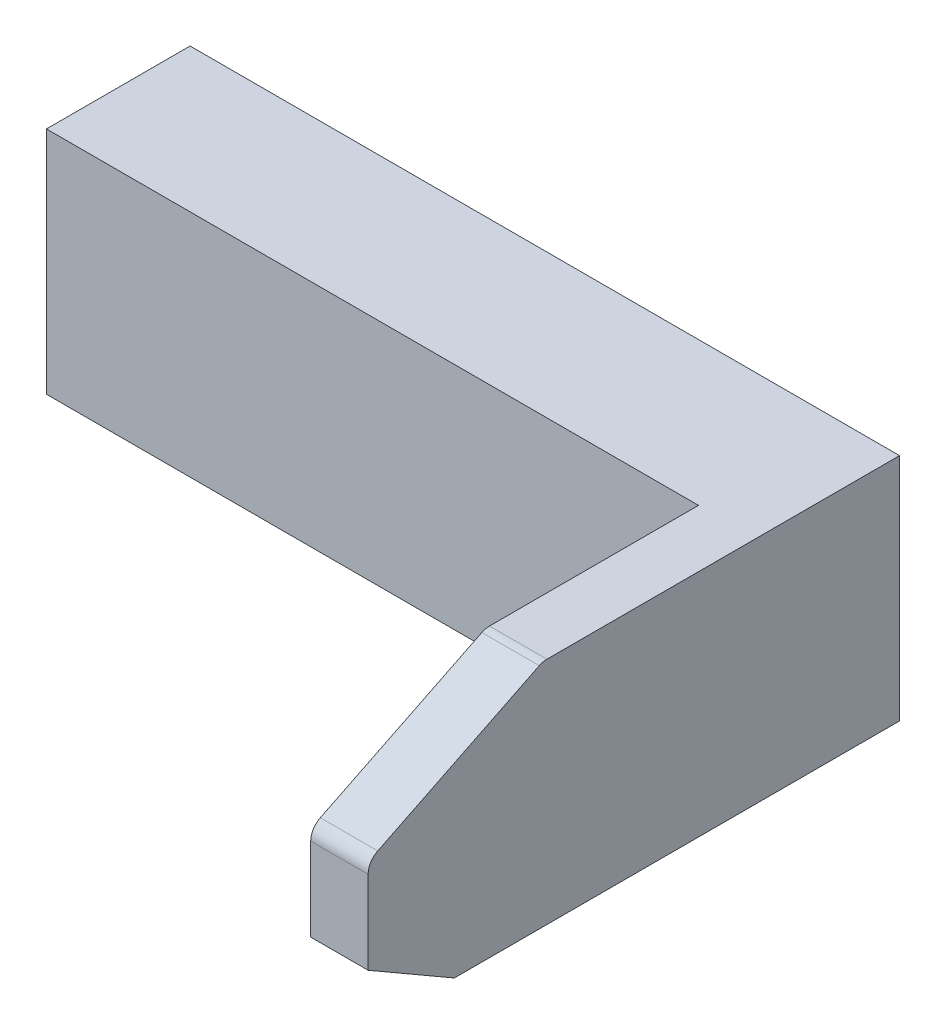
ISO-10303-21;
HEADER;
FILE_DESCRIPTION(('STEP AP214'),'2;1');
FILE_NAME('part.step','',(''),(''),'','','');
FILE_SCHEMA(('AUTOMOTIVE_DESIGN { 1 0 10303 214 1 1 1 1 }'));
ENDSEC;
DATA;
#1=APPLICATION_CONTEXT('core data for automotive mechanical design processes');
#2=APPLICATION_PROTOCOL_DEFINITION('international standard','automotive_design',2000,#1);
#3=PRODUCT_CONTEXT('',#1,'mechanical');
#4=PRODUCT('Part','Part','',(#3));
#5=PRODUCT_RELATED_PRODUCT_CATEGORY('part','',(#4));
#6=PRODUCT_DEFINITION_FORMATION('','',#4);
#7=PRODUCT_DEFINITION_CONTEXT('part definition',#1,'design');
#8=PRODUCT_DEFINITION('design','',#6,#7);
#9=PRODUCT_DEFINITION_SHAPE('','',#8);
#10=(LENGTH_UNIT() NAMED_UNIT(*) SI_UNIT(.MILLI.,.METRE.));
#11=(NAMED_UNIT(*) PLANE_ANGLE_UNIT() SI_UNIT($,.RADIAN.));
#12=(NAMED_UNIT(*) SI_UNIT($,.STERADIAN.) SOLID_ANGLE_UNIT());
#13=UNCERTAINTY_MEASURE_WITH_UNIT(LENGTH_MEASURE(1.E-05),#10,'distance_accuracy_value','');
#14=(GEOMETRIC_REPRESENTATION_CONTEXT(3) GLOBAL_UNCERTAINTY_ASSIGNED_CONTEXT((#13)) GLOBAL_UNIT_ASSIGNED_CONTEXT((#10,
#11,#12)) REPRESENTATION_CONTEXT('',''));
#15=CARTESIAN_POINT('',(0.,0.,0.));
#16=DIRECTION('',(0.,0.,1.));
#17=DIRECTION('',(1.,0.,0.));
#18=AXIS2_PLACEMENT_3D('',#15,#16,#17);
#19=CARTESIAN_POINT('',(0.,0.,0.));
#20=DIRECTION('',(1.,0.,0.));
#21=DIRECTION('',(0.,0.,1.));
#22=AXIS2_PLACEMENT_3D('',#19,#20,#21);
#23=PLANE('',#22);
#24=CARTESIAN_POINT('',(0.,0.129573170731694,35.5853658536586));
#25=DIRECTION('',(1.,0.,0.));
#26=DIRECTION('',(0.,0.,-1.));
#27=AXIS2_PLACEMENT_3D('',#24,#25,#26);
#28=CIRCLE('',#27,5.5);
#29=CARTESIAN_POINT('',(0.,0.129573170731694,30.0853658536586));
#30=VERTEX_POINT('',#29);
#31=EDGE_CURVE('E214',#30,#30,#28,.T.);
#32=ORIENTED_EDGE('',*,*,#31,.T.);
#33=EDGE_LOOP('',(#32));
#34=FACE_BOUND('',#33,.T.);
#35=DIRECTION('',(0.,1.,0.));
#36=VECTOR('',#35,1.);
#37=CARTESIAN_POINT('',(0.,20.1295731707317,56.5853658536586));
#38=LINE('',#37,#36);
#39=CARTESIAN_POINT('',(0.,-11.2101727914239,56.5853658536586));
#40=VERTEX_POINT('',#39);
#41=CARTESIAN_POINT('',(0.,3.2640532905269,56.5853658536586));
#42=VERTEX_POINT('',#41);
#43=EDGE_CURVE('E235',#40,#42,#38,.T.);
#44=ORIENTED_EDGE('',*,*,#43,.T.);
#45=CARTESIAN_POINT('',(0.,3.2640532905269,53.5853658536586));
#46=DIRECTION('',(-1.,0.,0.));
#47=DIRECTION('',(0.,0.,1.));
#48=AXIS2_PLACEMENT_3D('',#45,#46,#47);
#49=CIRCLE('',#48,3.);
#50=CARTESIAN_POINT('',(0.,5.95467151512495,54.9122319243156));
#51=VERTEX_POINT('',#50);
#52=EDGE_CURVE('E279',#51,#42,#49,.F.);
#53=ORIENTED_EDGE('',*,*,#52,.F.);
#54=DIRECTION('',(0.,0.442288690219003,-0.896872741532688));
#55=VECTOR('',#54,1.);
#56=CARTESIAN_POINT('',(0.,20.1295731707317,26.1683748238203));
#57=LINE('',#56,#55);
#58=CARTESIAN_POINT('',(0.,19.8201913953298,26.7957390029667));
#59=VERTEX_POINT('',#58);
#60=EDGE_CURVE('E266',#59,#51,#57,.F.);
#61=ORIENTED_EDGE('',*,*,#60,.F.);
#62=CARTESIAN_POINT('',(0.,17.1295731707317,25.4688729323097));
#63=DIRECTION('',(-1.,0.,0.));
#64=DIRECTION('',(0.,0.,1.));
#65=AXIS2_PLACEMENT_3D('',#62,#63,#64);
#66=CIRCLE('',#65,3.);
#67=CARTESIAN_POINT('',(0.,20.1295731707317,25.4688729323097));
#68=VERTEX_POINT('',#67);
#69=EDGE_CURVE('E282',#68,#59,#66,.F.);
#70=ORIENTED_EDGE('',*,*,#69,.F.);
#71=DIRECTION('',(0.,0.,-1.));
#72=VECTOR('',#71,1.);
#73=CARTESIAN_POINT('',(0.,20.1295731707317,-35.9146341463414));
#74=LINE('',#73,#72);
#75=CARTESIAN_POINT('',(0.,20.1295731707317,-10.9146341463414));
#76=VERTEX_POINT('',#75);
#77=EDGE_CURVE('E225',#68,#76,#74,.T.);
#78=ORIENTED_EDGE('',*,*,#77,.T.);
#79=DIRECTION('',(0.,-1.,0.));
#80=VECTOR('',#79,1.);
#81=CARTESIAN_POINT('',(0.,20.1295731707317,-10.9146341463414));
#82=LINE('',#81,#80);
#83=CARTESIAN_POINT('',(0.,-19.8704268292683,-10.9146341463414));
#84=VERTEX_POINT('',#83);
#85=EDGE_CURVE('E179',#76,#84,#82,.T.);
#86=ORIENTED_EDGE('',*,*,#85,.T.);
#87=DIRECTION('',(0.,0.,1.));
#88=VECTOR('',#87,1.);
#89=CARTESIAN_POINT('',(0.,-19.8704268292683,-35.9146341463414));
#90=LINE('',#89,#88);
#91=CARTESIAN_POINT('',(0.,-19.8704268292683,41.5853658536585));
#92=VERTEX_POINT('',#91);
#93=EDGE_CURVE('E218',#84,#92,#90,.T.);
#94=ORIENTED_EDGE('',*,*,#93,.T.);
#95=DIRECTION('',(0.,0.499999999999998,0.86602540378444));
#96=VECTOR('',#95,1.);
#97=CARTESIAN_POINT('',(0.,-11.2101727914239,56.5853658536586));
#98=LINE('',#97,#96);
#99=EDGE_CURVE('E299',#40,#92,#98,.F.);
#100=ORIENTED_EDGE('',*,*,#99,.F.);
#101=EDGE_LOOP('',(#44,#53,#61,#70,#78,#86,#94,#100));
#102=FACE_BOUND('',#101,.T.);
#103=ADVANCED_FACE('F47',(#34,#102),#23,.F.);
#104=CARTESIAN_POINT('',(10.,20.1295731707317,-35.9146341463414));
#105=DIRECTION('',(0.,0.,1.));
#106=DIRECTION('',(0.,1.,0.));
#107=AXIS2_PLACEMENT_3D('',#104,#105,#106);
#108=PLANE('',#107);
#109=DIRECTION('',(-1.,0.,0.));
#110=VECTOR('',#109,1.);
#111=CARTESIAN_POINT('',(10.,20.1295731707317,-35.9146341463414));
#112=LINE('',#111,#110);
#113=CARTESIAN_POINT('',(10.,20.1295731707317,-35.9146341463414));
#114=VERTEX_POINT('',#113);
#115=CARTESIAN_POINT('',(-113.5,20.1295731707317,-35.9146341463414));
#116=VERTEX_POINT('',#115);
#117=EDGE_CURVE('E232',#114,#116,#112,.T.);
#118=ORIENTED_EDGE('',*,*,#117,.F.);
#119=DIRECTION('',(0.,-1.,0.));
#120=VECTOR('',#119,1.);
#121=CARTESIAN_POINT('',(10.,20.1295731707317,-35.9146341463414));
#122=LINE('',#121,#120);
#123=CARTESIAN_POINT('',(10.,-19.8704268292683,-35.9146341463414));
#124=VERTEX_POINT('',#123);
#125=EDGE_CURVE('E221',#114,#124,#122,.T.);
#126=ORIENTED_EDGE('',*,*,#125,.T.);
#127=DIRECTION('',(-1.,0.,0.));
#128=VECTOR('',#127,1.);
#129=CARTESIAN_POINT('',(10.,-19.8704268292683,-35.9146341463414));
#130=LINE('',#129,#128);
#131=CARTESIAN_POINT('',(-113.5,-19.8704268292683,-35.9146341463414));
#132=VERTEX_POINT('',#131);
#133=EDGE_CURVE('E242',#124,#132,#130,.T.);
#134=ORIENTED_EDGE('',*,*,#133,.T.);
#135=DIRECTION('',(0.,1.,0.));
#136=VECTOR('',#135,1.);
#137=CARTESIAN_POINT('',(-113.5,20.1295731707317,-35.9146341463414));
#138=LINE('',#137,#136);
#139=EDGE_CURVE('E202',#132,#116,#138,.T.);
#140=ORIENTED_EDGE('',*,*,#139,.T.);
#141=EDGE_LOOP('',(#118,#126,#134,#140));
#142=FACE_BOUND('',#141,.T.);
#143=ADVANCED_FACE('F311',(#142),#108,.F.);
#144=CARTESIAN_POINT('',(10.,-19.8704268292683,-35.9146341463414));
#145=DIRECTION('',(0.,1.,0.));
#146=DIRECTION('',(0.,0.,-1.));
#147=AXIS2_PLACEMENT_3D('',#144,#145,#146);
#148=PLANE('',#147);
#149=ORIENTED_EDGE('',*,*,#93,.F.);
#150=DIRECTION('',(1.,0.,0.));
#151=VECTOR('',#150,1.);
#152=CARTESIAN_POINT('',(-113.5,-19.8704268292683,-10.9146341463414));
#153=LINE('',#152,#151);
#154=CARTESIAN_POINT('',(-113.5,-19.8704268292683,-10.9146341463414));
#155=VERTEX_POINT('',#154);
#156=EDGE_CURVE('E212',#155,#84,#153,.T.);
#157=ORIENTED_EDGE('',*,*,#156,.F.);
#158=DIRECTION('',(0.,0.,-1.));
#159=VECTOR('',#158,1.);
#160=CARTESIAN_POINT('',(-113.5,-19.8704268292683,-10.9146341463414));
#161=LINE('',#160,#159);
#162=EDGE_CURVE('E200',#155,#132,#161,.T.);
#163=ORIENTED_EDGE('',*,*,#162,.T.);
#164=ORIENTED_EDGE('',*,*,#133,.F.);
#165=DIRECTION('',(0.,0.,1.));
#166=VECTOR('',#165,1.);
#167=CARTESIAN_POINT('',(10.,-19.8704268292683,-35.9146341463414));
#168=LINE('',#167,#166);
#169=CARTESIAN_POINT('',(10.,-19.8704268292683,41.5853658536585));
#170=VERTEX_POINT('',#169);
#171=EDGE_CURVE('E224',#124,#170,#168,.T.);
#172=ORIENTED_EDGE('',*,*,#171,.T.);
#173=DIRECTION('',(1.,0.,0.));
#174=VECTOR('',#173,1.);
#175=CARTESIAN_POINT('',(10.,-19.8704268292683,41.5853658536585));
#176=LINE('',#175,#174);
#177=EDGE_CURVE('E55',#92,#170,#176,.T.);
#178=ORIENTED_EDGE('',*,*,#177,.F.);
#179=EDGE_LOOP('',(#149,#157,#163,#164,#172,#178));
#180=FACE_BOUND('',#179,.T.);
#181=ADVANCED_FACE('F304',(#180),#148,.F.);
#182=CARTESIAN_POINT('',(10.,20.1295731707317,56.5853658536586));
#183=DIRECTION('',(0.,0.,-1.));
#184=DIRECTION('',(1.,0.,0.));
#185=AXIS2_PLACEMENT_3D('',#182,#183,#184);
#186=PLANE('',#185);
#187=DIRECTION('',(0.,1.,0.));
#188=VECTOR('',#187,1.);
#189=CARTESIAN_POINT('',(10.,20.1295731707317,56.5853658536586));
#190=LINE('',#189,#188);
#191=CARTESIAN_POINT('',(10.,-11.2101727914239,56.5853658536586));
#192=VERTEX_POINT('',#191);
#193=CARTESIAN_POINT('',(10.,3.2640532905269,56.5853658536586));
#194=VERTEX_POINT('',#193);
#195=EDGE_CURVE('E227',#192,#194,#190,.T.);
#196=ORIENTED_EDGE('',*,*,#195,.T.);
#197=DIRECTION('',(-1.,0.,0.));
#198=VECTOR('',#197,1.);
#199=CARTESIAN_POINT('',(10.,3.2640532905269,56.5853658536586));
#200=LINE('',#199,#198);
#201=EDGE_CURVE('E294',#42,#194,#200,.F.);
#202=ORIENTED_EDGE('',*,*,#201,.F.);
#203=ORIENTED_EDGE('',*,*,#43,.F.);
#204=DIRECTION('',(-1.,0.,0.));
#205=VECTOR('',#204,1.);
#206=CARTESIAN_POINT('',(10.,-11.2101727914239,56.5853658536586));
#207=LINE('',#206,#205);
#208=EDGE_CURVE('E297',#192,#40,#207,.T.);
#209=ORIENTED_EDGE('',*,*,#208,.F.);
#210=EDGE_LOOP('',(#196,#202,#203,#209));
#211=FACE_BOUND('',#210,.T.);
#212=ADVANCED_FACE('F329',(#211),#186,.F.);
#213=CARTESIAN_POINT('',(10.,20.1295731707317,-35.9146341463414));
#214=DIRECTION('',(0.,-1.,0.));
#215=DIRECTION('',(0.,0.,1.));
#216=AXIS2_PLACEMENT_3D('',#213,#214,#215);
#217=PLANE('',#216);
#218=DIRECTION('',(0.,0.,-1.));
#219=VECTOR('',#218,1.);
#220=CARTESIAN_POINT('',(10.,20.1295731707317,-35.9146341463414));
#221=LINE('',#220,#219);
#222=CARTESIAN_POINT('',(10.,20.1295731707317,25.4688729323097));
#223=VERTEX_POINT('',#222);
#224=EDGE_CURVE('E230',#223,#114,#221,.T.);
#225=ORIENTED_EDGE('',*,*,#224,.T.);
#226=ORIENTED_EDGE('',*,*,#117,.T.);
#227=DIRECTION('',(0.,0.,1.));
#228=VECTOR('',#227,1.);
#229=CARTESIAN_POINT('',(-113.5,20.1295731707317,-10.9146341463414));
#230=LINE('',#229,#228);
#231=CARTESIAN_POINT('',(-113.5,20.1295731707317,-10.9146341463414));
#232=VERTEX_POINT('',#231);
#233=EDGE_CURVE('E205',#116,#232,#230,.T.);
#234=ORIENTED_EDGE('',*,*,#233,.T.);
#235=DIRECTION('',(1.,0.,0.));
#236=VECTOR('',#235,1.);
#237=CARTESIAN_POINT('',(-113.5,20.1295731707317,-10.9146341463414));
#238=LINE('',#237,#236);
#239=EDGE_CURVE('E208',#232,#76,#238,.T.);
#240=ORIENTED_EDGE('',*,*,#239,.T.);
#241=ORIENTED_EDGE('',*,*,#77,.F.);
#242=DIRECTION('',(1.,0.,0.));
#243=VECTOR('',#242,1.);
#244=CARTESIAN_POINT('',(0.,20.1295731707317,25.4688729323097));
#245=LINE('',#244,#243);
#246=EDGE_CURVE('E277',#223,#68,#245,.F.);
#247=ORIENTED_EDGE('',*,*,#246,.F.);
#248=EDGE_LOOP('',(#225,#226,#234,#240,#241,#247));
#249=FACE_BOUND('',#248,.T.);
#250=ADVANCED_FACE('F314',(#249),#217,.F.);
#251=CARTESIAN_POINT('',(10.,0.,0.));
#252=DIRECTION('',(1.,0.,0.));
#253=DIRECTION('',(0.,0.,1.));
#254=AXIS2_PLACEMENT_3D('',#251,#252,#253);
#255=PLANE('',#254);
#256=ORIENTED_EDGE('',*,*,#171,.F.);
#257=ORIENTED_EDGE('',*,*,#125,.F.);
#258=ORIENTED_EDGE('',*,*,#224,.F.);
#259=CARTESIAN_POINT('',(10.,17.1295731707317,25.4688729323097));
#260=DIRECTION('',(-1.,0.,0.));
#261=DIRECTION('',(0.,0.,1.));
#262=AXIS2_PLACEMENT_3D('',#259,#260,#261);
#263=CIRCLE('',#262,3.);
#264=CARTESIAN_POINT('',(10.,19.8201913953298,26.7957390029667));
#265=VERTEX_POINT('',#264);
#266=EDGE_CURVE('E292',#265,#223,#263,.T.);
#267=ORIENTED_EDGE('',*,*,#266,.F.);
#268=DIRECTION('',(0.,-0.442288690219003,0.896872741532688));
#269=VECTOR('',#268,1.);
#270=CARTESIAN_POINT('',(10.,26.5722242379764,13.1039708424363));
#271=LINE('',#270,#269);
#272=CARTESIAN_POINT('',(10.,5.95467151512495,54.9122319243156));
#273=VERTEX_POINT('',#272);
#274=EDGE_CURVE('E274',#273,#265,#271,.F.);
#275=ORIENTED_EDGE('',*,*,#274,.F.);
#276=CARTESIAN_POINT('',(10.,3.2640532905269,53.5853658536586));
#277=DIRECTION('',(-1.,0.,0.));
#278=DIRECTION('',(0.,0.,1.));
#279=AXIS2_PLACEMENT_3D('',#276,#277,#278);
#280=CIRCLE('',#279,3.);
#281=EDGE_CURVE('E289',#194,#273,#280,.T.);
#282=ORIENTED_EDGE('',*,*,#281,.F.);
#283=ORIENTED_EDGE('',*,*,#195,.F.);
#284=DIRECTION('',(0.,-0.499999999999998,-0.86602540378444));
#285=VECTOR('',#284,1.);
#286=CARTESIAN_POINT('',(10.,-32.9098117494203,19.0004886725076));
#287=LINE('',#286,#285);
#288=EDGE_CURVE('E11',#170,#192,#287,.F.);
#289=ORIENTED_EDGE('',*,*,#288,.F.);
#290=EDGE_LOOP('',(#256,#257,#258,#267,#275,#282,#283,#289));
#291=FACE_BOUND('',#290,.T.);
#292=ADVANCED_FACE('F306',(#291),#255,.T.);
#293=CARTESIAN_POINT('',(8.5,0.129573170731694,35.5853658536586));
#294=DIRECTION('',(-1.,0.,0.));
#295=DIRECTION('',(0.,0.,-1.));
#296=AXIS2_PLACEMENT_3D('',#293,#294,#295);
#297=CYLINDRICAL_SURFACE('',#296,5.5);
#298=CARTESIAN_POINT('',(8.5,0.129573170731694,35.5853658536586));
#299=DIRECTION('',(1.,0.,0.));
#300=DIRECTION('',(0.,0.,-1.));
#301=AXIS2_PLACEMENT_3D('',#298,#299,#300);
#302=CIRCLE('',#301,5.5);
#303=CARTESIAN_POINT('',(8.5,0.129573170731694,30.0853658536586));
#304=VERTEX_POINT('',#303);
#305=EDGE_CURVE('E215',#304,#304,#302,.T.);
#306=ORIENTED_EDGE('',*,*,#305,.T.);
#307=EDGE_LOOP('',(#306));
#308=FACE_BOUND('',#307,.T.);
#309=ORIENTED_EDGE('',*,*,#31,.F.);
#310=EDGE_LOOP('',(#309));
#311=FACE_BOUND('',#310,.T.);
#312=ADVANCED_FACE('F348',(#308,#311),#297,.F.);
#313=CARTESIAN_POINT('',(8.5,0.129573170731694,35.5853658536586));
#314=DIRECTION('',(-1.,0.,0.));
#315=DIRECTION('',(0.,0.,-1.));
#316=AXIS2_PLACEMENT_3D('',#313,#314,#315);
#317=PLANE('',#316);
#318=ORIENTED_EDGE('',*,*,#305,.F.);
#319=EDGE_LOOP('',(#318));
#320=FACE_BOUND('',#319,.T.);
#321=ADVANCED_FACE('F340',(#320),#317,.T.);
#322=CARTESIAN_POINT('',(-113.5,0.,0.));
#323=DIRECTION('',(-1.,0.,0.));
#324=DIRECTION('',(0.,0.,-1.));
#325=AXIS2_PLACEMENT_3D('',#322,#323,#324);
#326=PLANE('',#325);
#327=DIRECTION('',(0.,1.,0.));
#328=VECTOR('',#327,1.);
#329=CARTESIAN_POINT('',(-113.5,0.,-31.5396341463414));
#330=LINE('',#329,#328);
#331=CARTESIAN_POINT('',(-113.5,15.7545731707317,-31.5396341463414));
#332=VERTEX_POINT('',#331);
#333=CARTESIAN_POINT('',(-113.5,-15.4954268292683,-31.5396341463414));
#334=VERTEX_POINT('',#333);
#335=EDGE_CURVE('E254',#332,#334,#330,.F.);
#336=ORIENTED_EDGE('',*,*,#335,.F.);
#337=DIRECTION('',(0.,0.,1.));
#338=VECTOR('',#337,1.);
#339=CARTESIAN_POINT('',(-113.5,15.7545731707317,0.));
#340=LINE('',#339,#338);
#341=CARTESIAN_POINT('',(-113.5,15.7545731707317,-15.2896341463414));
#342=VERTEX_POINT('',#341);
#343=EDGE_CURVE('E251',#342,#332,#340,.F.);
#344=ORIENTED_EDGE('',*,*,#343,.F.);
#345=DIRECTION('',(0.,-1.,0.));
#346=VECTOR('',#345,1.);
#347=CARTESIAN_POINT('',(-113.5,0.,-15.2896341463414));
#348=LINE('',#347,#346);
#349=CARTESIAN_POINT('',(-113.5,-15.4954268292683,-15.2896341463414));
#350=VERTEX_POINT('',#349);
#351=EDGE_CURVE('E248',#350,#342,#348,.F.);
#352=ORIENTED_EDGE('',*,*,#351,.F.);
#353=DIRECTION('',(0.,0.,-1.));
#354=VECTOR('',#353,1.);
#355=CARTESIAN_POINT('',(-113.5,-15.4954268292683,0.));
#356=LINE('',#355,#354);
#357=EDGE_CURVE('E257',#334,#350,#356,.F.);
#358=ORIENTED_EDGE('',*,*,#357,.F.);
#359=EDGE_LOOP('',(#336,#344,#352,#358));
#360=FACE_BOUND('',#359,.T.);
#361=DIRECTION('',(0.,-1.,0.));
#362=VECTOR('',#361,1.);
#363=CARTESIAN_POINT('',(-113.5,20.1295731707317,-10.9146341463414));
#364=LINE('',#363,#362);
#365=EDGE_CURVE('E198',#232,#155,#364,.T.);
#366=ORIENTED_EDGE('',*,*,#365,.F.);
#367=ORIENTED_EDGE('',*,*,#233,.F.);
#368=ORIENTED_EDGE('',*,*,#139,.F.);
#369=ORIENTED_EDGE('',*,*,#162,.F.);
#370=EDGE_LOOP('',(#366,#367,#368,#369));
#371=FACE_BOUND('',#370,.T.);
#372=ADVANCED_FACE('F338',(#360,#371),#326,.T.);
#373=CARTESIAN_POINT('',(-113.5,20.1295731707317,-10.9146341463414));
#374=DIRECTION('',(0.,0.,-1.));
#375=DIRECTION('',(0.,-1.,0.));
#376=AXIS2_PLACEMENT_3D('',#373,#374,#375);
#377=PLANE('',#376);
#378=ORIENTED_EDGE('',*,*,#85,.F.);
#379=ORIENTED_EDGE('',*,*,#239,.F.);
#380=ORIENTED_EDGE('',*,*,#365,.T.);
#381=ORIENTED_EDGE('',*,*,#156,.T.);
#382=EDGE_LOOP('',(#378,#379,#380,#381));
#383=FACE_BOUND('',#382,.T.);
#384=ADVANCED_FACE('F335',(#383),#377,.F.);
#385=CARTESIAN_POINT('',(-113.5,12.7545731707317,-18.2896341463414));
#386=DIRECTION('',(0.,-1.,0.));
#387=DIRECTION('',(0.,0.,1.));
#388=AXIS2_PLACEMENT_3D('',#385,#386,#387);
#389=PLANE('',#388);
#390=DIRECTION('',(1.,0.,0.));
#391=VECTOR('',#390,1.);
#392=CARTESIAN_POINT('',(-113.5,12.7545731707317,-28.5396341463414));
#393=LINE('',#392,#391);
#394=CARTESIAN_POINT('',(-110.5,12.7545731707317,-28.5396341463414));
#395=VERTEX_POINT('',#394);
#396=CARTESIAN_POINT('',(0.,12.7545731707317,-28.5396341463414));
#397=VERTEX_POINT('',#396);
#398=EDGE_CURVE('E184',#395,#397,#393,.T.);
#399=ORIENTED_EDGE('',*,*,#398,.T.);
#400=DIRECTION('',(0.,0.,1.));
#401=VECTOR('',#400,1.);
#402=CARTESIAN_POINT('',(0.,12.7545731707317,-18.2896341463414));
#403=LINE('',#402,#401);
#404=CARTESIAN_POINT('',(0.,12.7545731707317,-18.2896341463414));
#405=VERTEX_POINT('',#404);
#406=EDGE_CURVE('E162',#397,#405,#403,.T.);
#407=ORIENTED_EDGE('',*,*,#406,.T.);
#408=DIRECTION('',(1.,0.,0.));
#409=VECTOR('',#408,1.);
#410=CARTESIAN_POINT('',(-113.5,12.7545731707317,-18.2896341463414));
#411=LINE('',#410,#409);
#412=CARTESIAN_POINT('',(-110.5,12.7545731707317,-18.2896341463414));
#413=VERTEX_POINT('',#412);
#414=EDGE_CURVE('E172',#413,#405,#411,.T.);
#415=ORIENTED_EDGE('',*,*,#414,.F.);
#416=DIRECTION('',(0.,0.,1.));
#417=VECTOR('',#416,1.);
#418=CARTESIAN_POINT('',(-110.5,12.7545731707317,-18.2896341463414));
#419=LINE('',#418,#417);
#420=EDGE_CURVE('E263',#395,#413,#419,.T.);
#421=ORIENTED_EDGE('',*,*,#420,.F.);
#422=EDGE_LOOP('',(#399,#407,#415,#421));
#423=FACE_BOUND('',#422,.T.);
#424=ADVANCED_FACE('F182',(#423),#389,.T.);
#425=CARTESIAN_POINT('',(-113.5,12.7545731707317,-18.2896341463414));
#426=DIRECTION('',(0.,0.,-1.));
#427=DIRECTION('',(0.,-1.,0.));
#428=AXIS2_PLACEMENT_3D('',#425,#426,#427);
#429=PLANE('',#428);
#430=ORIENTED_EDGE('',*,*,#414,.T.);
#431=DIRECTION('',(0.,-1.,0.));
#432=VECTOR('',#431,1.);
#433=CARTESIAN_POINT('',(0.,12.7545731707317,-18.2896341463414));
#434=LINE('',#433,#432);
#435=CARTESIAN_POINT('',(0.,-12.4954268292683,-18.2896341463414));
#436=VERTEX_POINT('',#435);
#437=EDGE_CURVE('E158',#405,#436,#434,.T.);
#438=ORIENTED_EDGE('',*,*,#437,.T.);
#439=DIRECTION('',(1.,0.,0.));
#440=VECTOR('',#439,1.);
#441=CARTESIAN_POINT('',(-113.5,-12.4954268292683,-18.2896341463414));
#442=LINE('',#441,#440);
#443=CARTESIAN_POINT('',(-110.5,-12.4954268292683,-18.2896341463414));
#444=VERTEX_POINT('',#443);
#445=EDGE_CURVE('E180',#444,#436,#442,.T.);
#446=ORIENTED_EDGE('',*,*,#445,.F.);
#447=DIRECTION('',(0.,-1.,0.));
#448=VECTOR('',#447,1.);
#449=CARTESIAN_POINT('',(-110.5,12.7545731707317,-18.2896341463414));
#450=LINE('',#449,#448);
#451=EDGE_CURVE('E175',#413,#444,#450,.T.);
#452=ORIENTED_EDGE('',*,*,#451,.F.);
#453=EDGE_LOOP('',(#430,#438,#446,#452));
#454=FACE_BOUND('',#453,.T.);
#455=ADVANCED_FACE('F173',(#454),#429,.T.);
#456=CARTESIAN_POINT('',(-113.5,-12.4954268292683,-18.2896341463414));
#457=DIRECTION('',(0.,1.,0.));
#458=DIRECTION('',(0.,0.,-1.));
#459=AXIS2_PLACEMENT_3D('',#456,#457,#458);
#460=PLANE('',#459);
#461=ORIENTED_EDGE('',*,*,#445,.T.);
#462=DIRECTION('',(0.,0.,-1.));
#463=VECTOR('',#462,1.);
#464=CARTESIAN_POINT('',(0.,-12.4954268292683,-18.2896341463414));
#465=LINE('',#464,#463);
#466=CARTESIAN_POINT('',(0.,-12.4954268292683,-28.5396341463414));
#467=VERTEX_POINT('',#466);
#468=EDGE_CURVE('E165',#436,#467,#465,.T.);
#469=ORIENTED_EDGE('',*,*,#468,.T.);
#470=DIRECTION('',(1.,0.,0.));
#471=VECTOR('',#470,1.);
#472=CARTESIAN_POINT('',(-113.5,-12.4954268292683,-28.5396341463414));
#473=LINE('',#472,#471);
#474=CARTESIAN_POINT('',(-110.5,-12.4954268292683,-28.5396341463414));
#475=VERTEX_POINT('',#474);
#476=EDGE_CURVE('E194',#475,#467,#473,.T.);
#477=ORIENTED_EDGE('',*,*,#476,.F.);
#478=DIRECTION('',(0.,0.,-1.));
#479=VECTOR('',#478,1.);
#480=CARTESIAN_POINT('',(-110.5,-12.4954268292683,-18.2896341463414));
#481=LINE('',#480,#479);
#482=EDGE_CURVE('E245',#444,#475,#481,.T.);
#483=ORIENTED_EDGE('',*,*,#482,.F.);
#484=EDGE_LOOP('',(#461,#469,#477,#483));
#485=FACE_BOUND('',#484,.T.);
#486=ADVANCED_FACE('F372',(#485),#460,.T.);
#487=CARTESIAN_POINT('',(-113.5,12.7545731707317,-28.5396341463414));
#488=DIRECTION('',(0.,0.,1.));
#489=DIRECTION('',(0.,1.,0.));
#490=AXIS2_PLACEMENT_3D('',#487,#488,#489);
#491=PLANE('',#490);
#492=ORIENTED_EDGE('',*,*,#476,.T.);
#493=DIRECTION('',(0.,1.,0.));
#494=VECTOR('',#493,1.);
#495=CARTESIAN_POINT('',(0.,12.7545731707317,-28.5396341463414));
#496=LINE('',#495,#494);
#497=EDGE_CURVE('E191',#467,#397,#496,.T.);
#498=ORIENTED_EDGE('',*,*,#497,.T.);
#499=ORIENTED_EDGE('',*,*,#398,.F.);
#500=DIRECTION('',(0.,1.,0.));
#501=VECTOR('',#500,1.);
#502=CARTESIAN_POINT('',(-110.5,12.7545731707317,-28.5396341463414));
#503=LINE('',#502,#501);
#504=EDGE_CURVE('E260',#475,#395,#503,.T.);
#505=ORIENTED_EDGE('',*,*,#504,.F.);
#506=EDGE_LOOP('',(#492,#498,#499,#505));
#507=FACE_BOUND('',#506,.T.);
#508=ADVANCED_FACE('F364',(#507),#491,.T.);
#509=ORIENTED_EDGE('',*,*,#497,.F.);
#510=ORIENTED_EDGE('',*,*,#468,.F.);
#511=ORIENTED_EDGE('',*,*,#437,.F.);
#512=ORIENTED_EDGE('',*,*,#406,.F.);
#513=EDGE_LOOP('',(#509,#510,#511,#512));
#514=FACE_BOUND('',#513,.T.);
#515=ADVANCED_FACE('F160',(#514),#23,.F.);
#516=CARTESIAN_POINT('',(-110.5,15.7545731707317,-18.2896341463414));
#517=DIRECTION('',(0.,0.,1.));
#518=DIRECTION('',(-1.,0.,0.));
#519=AXIS2_PLACEMENT_3D('',#516,#517,#518);
#520=CYLINDRICAL_SURFACE('',#519,3.);
#521=CARTESIAN_POINT('',(-110.5,15.7545731707317,-31.5396341463414));
#522=DIRECTION('',(0.,-0.707106781186547,-0.707106781186548));
#523=DIRECTION('',(0.,0.707106781186548,-0.707106781186547));
#524=AXIS2_PLACEMENT_3D('',#521,#522,#523);
#525=ELLIPSE('',#524,4.24264068711928,3.);
#526=EDGE_CURVE('E187',#332,#395,#525,.F.);
#527=ORIENTED_EDGE('',*,*,#526,.T.);
#528=ORIENTED_EDGE('',*,*,#420,.T.);
#529=CARTESIAN_POINT('',(-110.5,15.7545731707317,-15.2896341463414));
#530=DIRECTION('',(0.,0.707106781186548,-0.707106781186547));
#531=DIRECTION('',(0.,0.707106781186547,0.707106781186548));
#532=AXIS2_PLACEMENT_3D('',#529,#530,#531);
#533=ELLIPSE('',#532,4.24264068711929,3.);
#534=EDGE_CURVE('E185',#413,#342,#533,.T.);
#535=ORIENTED_EDGE('',*,*,#534,.T.);
#536=ORIENTED_EDGE('',*,*,#343,.T.);
#537=EDGE_LOOP('',(#527,#528,#535,#536));
#538=FACE_BOUND('',#537,.T.);
#539=ADVANCED_FACE('F363',(#538),#520,.T.);
#540=CARTESIAN_POINT('',(-110.5,12.7545731707317,-15.2896341463414));
#541=DIRECTION('',(0.,-1.,0.));
#542=DIRECTION('',(0.,0.,1.));
#543=AXIS2_PLACEMENT_3D('',#540,#541,#542);
#544=CYLINDRICAL_SURFACE('',#543,3.);
#545=ORIENTED_EDGE('',*,*,#534,.F.);
#546=ORIENTED_EDGE('',*,*,#451,.T.);
#547=CARTESIAN_POINT('',(-110.5,-15.4954268292683,-15.2896341463414));
#548=DIRECTION('',(0.,0.707106781186547,0.707106781186548));
#549=DIRECTION('',(0.,0.707106781186548,-0.707106781186547));
#550=AXIS2_PLACEMENT_3D('',#547,#548,#549);
#551=ELLIPSE('',#550,4.24264068711928,3.);
#552=EDGE_CURVE('E269',#444,#350,#551,.T.);
#553=ORIENTED_EDGE('',*,*,#552,.T.);
#554=ORIENTED_EDGE('',*,*,#351,.T.);
#555=EDGE_LOOP('',(#545,#546,#553,#554));
#556=FACE_BOUND('',#555,.T.);
#557=ADVANCED_FACE('F369',(#556),#544,.T.);
#558=CARTESIAN_POINT('',(-110.5,12.7545731707317,-31.5396341463414));
#559=DIRECTION('',(0.,1.,0.));
#560=DIRECTION('',(0.,0.,-1.));
#561=AXIS2_PLACEMENT_3D('',#558,#559,#560);
#562=CYLINDRICAL_SURFACE('',#561,3.);
#563=ORIENTED_EDGE('',*,*,#526,.F.);
#564=ORIENTED_EDGE('',*,*,#335,.T.);
#565=CARTESIAN_POINT('',(-110.5,-15.4954268292683,-31.5396341463414));
#566=DIRECTION('',(0.,-0.707106781186548,0.707106781186547));
#567=DIRECTION('',(0.,-0.707106781186547,-0.707106781186548));
#568=AXIS2_PLACEMENT_3D('',#565,#566,#567);
#569=ELLIPSE('',#568,4.24264068711929,3.);
#570=EDGE_CURVE('E267',#334,#475,#569,.F.);
#571=ORIENTED_EDGE('',*,*,#570,.T.);
#572=ORIENTED_EDGE('',*,*,#504,.T.);
#573=EDGE_LOOP('',(#563,#564,#571,#572));
#574=FACE_BOUND('',#573,.T.);
#575=ADVANCED_FACE('F422',(#574),#562,.T.);
#576=CARTESIAN_POINT('',(-110.5,-15.4954268292683,-18.2896341463414));
#577=DIRECTION('',(0.,0.,-1.));
#578=DIRECTION('',(1.,0.,0.));
#579=AXIS2_PLACEMENT_3D('',#576,#577,#578);
#580=CYLINDRICAL_SURFACE('',#579,3.);
#581=ORIENTED_EDGE('',*,*,#552,.F.);
#582=ORIENTED_EDGE('',*,*,#482,.T.);
#583=ORIENTED_EDGE('',*,*,#570,.F.);
#584=ORIENTED_EDGE('',*,*,#357,.T.);
#585=EDGE_LOOP('',(#581,#582,#583,#584));
#586=FACE_BOUND('',#585,.T.);
#587=ADVANCED_FACE('F433',(#586),#580,.T.);
#588=CARTESIAN_POINT('',(10.,20.1295731707317,26.1683748238203));
#589=DIRECTION('',(0.,-0.896872741532688,-0.442288690219002));
#590=DIRECTION('',(-1.,0.,0.));
#591=AXIS2_PLACEMENT_3D('',#588,#589,#590);
#592=PLANE('',#591);
#593=ORIENTED_EDGE('',*,*,#60,.T.);
#594=DIRECTION('',(1.,0.,0.));
#595=VECTOR('',#594,1.);
#596=CARTESIAN_POINT('',(0.,5.95467151512496,54.9122319243156));
#597=LINE('',#596,#595);
#598=EDGE_CURVE('E285',#273,#51,#597,.F.);
#599=ORIENTED_EDGE('',*,*,#598,.F.);
#600=ORIENTED_EDGE('',*,*,#274,.T.);
#601=DIRECTION('',(-1.,0.,0.));
#602=VECTOR('',#601,1.);
#603=CARTESIAN_POINT('',(10.,19.8201913953298,26.7957390029667));
#604=LINE('',#603,#602);
#605=EDGE_CURVE('E287',#59,#265,#604,.F.);
#606=ORIENTED_EDGE('',*,*,#605,.F.);
#607=EDGE_LOOP('',(#593,#599,#600,#606));
#608=FACE_BOUND('',#607,.T.);
#609=ADVANCED_FACE('F323',(#608),#592,.F.);
#610=CARTESIAN_POINT('',(10.,17.1295731707317,25.4688729323097));
#611=DIRECTION('',(-1.,0.,0.));
#612=DIRECTION('',(0.,0.,-1.));
#613=AXIS2_PLACEMENT_3D('',#610,#611,#612);
#614=CYLINDRICAL_SURFACE('',#613,3.);
#615=ORIENTED_EDGE('',*,*,#266,.T.);
#616=ORIENTED_EDGE('',*,*,#246,.T.);
#617=ORIENTED_EDGE('',*,*,#69,.T.);
#618=ORIENTED_EDGE('',*,*,#605,.T.);
#619=EDGE_LOOP('',(#615,#616,#617,#618));
#620=FACE_BOUND('',#619,.T.);
#621=ADVANCED_FACE('F319',(#620),#614,.T.);
#622=CARTESIAN_POINT('',(10.,3.2640532905269,53.5853658536586));
#623=DIRECTION('',(1.,0.,0.));
#624=DIRECTION('',(0.,0.,1.));
#625=AXIS2_PLACEMENT_3D('',#622,#623,#624);
#626=CYLINDRICAL_SURFACE('',#625,3.);
#627=ORIENTED_EDGE('',*,*,#52,.T.);
#628=ORIENTED_EDGE('',*,*,#201,.T.);
#629=ORIENTED_EDGE('',*,*,#281,.T.);
#630=ORIENTED_EDGE('',*,*,#598,.T.);
#631=EDGE_LOOP('',(#627,#628,#629,#630));
#632=FACE_BOUND('',#631,.T.);
#633=ADVANCED_FACE('F326',(#632),#626,.T.);
#634=CARTESIAN_POINT('',(10.,-11.2101727914239,56.5853658536586));
#635=DIRECTION('',(0.,0.86602540378444,-0.499999999999998));
#636=DIRECTION('',(-1.,0.,0.));
#637=AXIS2_PLACEMENT_3D('',#634,#635,#636);
#638=PLANE('',#637);
#639=ORIENTED_EDGE('',*,*,#288,.T.);
#640=ORIENTED_EDGE('',*,*,#208,.T.);
#641=ORIENTED_EDGE('',*,*,#99,.T.);
#642=ORIENTED_EDGE('',*,*,#177,.T.);
#643=EDGE_LOOP('',(#639,#640,#641,#642));
#644=FACE_BOUND('',#643,.T.);
#645=ADVANCED_FACE('F49',(#644),#638,.F.);
#646=CLOSED_SHELL('',(#103,#143,#181,#212,#250,#292,#312,#321,#372,#384,#424,#455,#486,#508,
#515,#539,#557,#575,#587,#609,#621,#633,#645));
#647=MANIFOLD_SOLID_BREP('B2',#646);
#648=ADVANCED_BREP_SHAPE_REPRESENTATION('',(#18,#647),#14);
#649=SHAPE_DEFINITION_REPRESENTATION(#9,#648);
ENDSEC;
END-ISO-10303-21;
